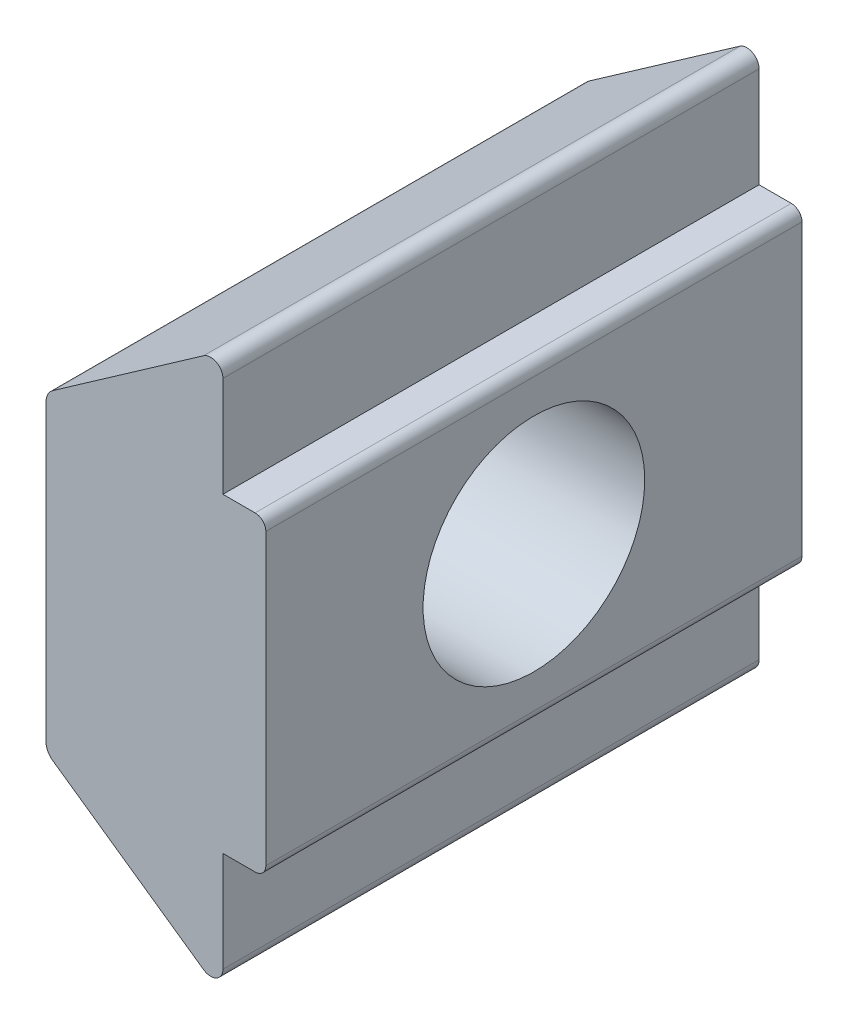
ISO-10303-21;
HEADER;
FILE_DESCRIPTION(('STEP AP214'),'2;1');
FILE_NAME('part.step','',(''),(''),'','','');
FILE_SCHEMA(('AUTOMOTIVE_DESIGN { 1 0 10303 214 1 1 1 1 }'));
ENDSEC;
DATA;
#1=APPLICATION_CONTEXT('core data for automotive mechanical design processes');
#2=APPLICATION_PROTOCOL_DEFINITION('international standard','automotive_design',2000,#1);
#3=PRODUCT_CONTEXT('',#1,'mechanical');
#4=PRODUCT('Part','Part','',(#3));
#5=PRODUCT_RELATED_PRODUCT_CATEGORY('part','',(#4));
#6=PRODUCT_DEFINITION_FORMATION('','',#4);
#7=PRODUCT_DEFINITION_CONTEXT('part definition',#1,'design');
#8=PRODUCT_DEFINITION('design','',#6,#7);
#9=PRODUCT_DEFINITION_SHAPE('','',#8);
#10=(LENGTH_UNIT() NAMED_UNIT(*) SI_UNIT(.MILLI.,.METRE.));
#11=(NAMED_UNIT(*) PLANE_ANGLE_UNIT() SI_UNIT($,.RADIAN.));
#12=(NAMED_UNIT(*) SI_UNIT($,.STERADIAN.) SOLID_ANGLE_UNIT());
#13=UNCERTAINTY_MEASURE_WITH_UNIT(LENGTH_MEASURE(1.E-05),#10,'distance_accuracy_value','');
#14=(GEOMETRIC_REPRESENTATION_CONTEXT(3) GLOBAL_UNCERTAINTY_ASSIGNED_CONTEXT((#13)) GLOBAL_UNIT_ASSIGNED_CONTEXT((#10,
#11,#12)) REPRESENTATION_CONTEXT('',''));
#15=CARTESIAN_POINT('',(0.,0.,0.));
#16=DIRECTION('',(0.,0.,1.));
#17=DIRECTION('',(1.,0.,0.));
#18=AXIS2_PLACEMENT_3D('',#15,#16,#17);
#19=CARTESIAN_POINT('',(-3.80000000000001,2.74382988483449,5.));
#20=DIRECTION('',(0.,0.,-1.));
#21=DIRECTION('',(-1.,0.,0.));
#22=AXIS2_PLACEMENT_3D('',#19,#20,#21);
#23=CYLINDRICAL_SURFACE('',#22,0.299999999999982);
#24=CARTESIAN_POINT('',(-3.80000000000001,2.74382988483449,-5.));
#25=DIRECTION('',(0.,0.,1.));
#26=DIRECTION('',(1.,0.,0.));
#27=AXIS2_PLACEMENT_3D('',#24,#25,#26);
#28=CIRCLE('',#27,0.299999999999982);
#29=CARTESIAN_POINT('',(-3.97207293090532,2.98957549812117,-5.));
#30=VERTEX_POINT('',#29);
#31=CARTESIAN_POINT('',(-4.1,2.74382988483449,-5.));
#32=VERTEX_POINT('',#31);
#33=EDGE_CURVE('E168',#30,#32,#28,.T.);
#34=ORIENTED_EDGE('',*,*,#33,.T.);
#35=DIRECTION('',(0.,0.,-1.));
#36=VECTOR('',#35,1.);
#37=CARTESIAN_POINT('',(-4.1,2.74382988483449,5.));
#38=LINE('',#37,#36);
#39=CARTESIAN_POINT('',(-4.1,2.74382988483449,5.));
#40=VERTEX_POINT('',#39);
#41=EDGE_CURVE('E11',#40,#32,#38,.T.);
#42=ORIENTED_EDGE('',*,*,#41,.F.);
#43=CARTESIAN_POINT('',(-3.80000000000001,2.74382988483449,5.));
#44=DIRECTION('',(0.,0.,1.));
#45=DIRECTION('',(1.,0.,0.));
#46=AXIS2_PLACEMENT_3D('',#43,#44,#45);
#47=CIRCLE('',#46,0.299999999999982);
#48=CARTESIAN_POINT('',(-3.97207293090532,2.98957549812117,5.));
#49=VERTEX_POINT('',#48);
#50=EDGE_CURVE('E195',#49,#40,#47,.T.);
#51=ORIENTED_EDGE('',*,*,#50,.F.);
#52=DIRECTION('',(0.,0.,-1.));
#53=VECTOR('',#52,1.);
#54=CARTESIAN_POINT('',(-3.97207293090532,2.98957549812117,5.));
#55=LINE('',#54,#53);
#56=EDGE_CURVE('E164',#49,#30,#55,.T.);
#57=ORIENTED_EDGE('',*,*,#56,.T.);
#58=EDGE_LOOP('',(#34,#42,#51,#57));
#59=FACE_BOUND('',#58,.T.);
#60=ADVANCED_FACE('F36',(#59),#23,.T.);
#61=CARTESIAN_POINT('',(-4.1,2.74382988483449,5.));
#62=DIRECTION('',(1.,0.,0.));
#63=DIRECTION('',(0.,1.,0.));
#64=AXIS2_PLACEMENT_3D('',#61,#62,#63);
#65=PLANE('',#64);
#66=CARTESIAN_POINT('',(-4.1,0.,0.));
#67=DIRECTION('',(1.,0.,0.));
#68=DIRECTION('',(0.,0.,-1.));
#69=AXIS2_PLACEMENT_3D('',#66,#67,#68);
#70=CIRCLE('',#69,2.067);
#71=CARTESIAN_POINT('',(-4.1,0.,-2.067));
#72=VERTEX_POINT('',#71);
#73=EDGE_CURVE('E172',#72,#72,#70,.T.);
#74=ORIENTED_EDGE('',*,*,#73,.T.);
#75=EDGE_LOOP('',(#74));
#76=FACE_BOUND('',#75,.T.);
#77=DIRECTION('',(0.,-1.,0.));
#78=VECTOR('',#77,1.);
#79=CARTESIAN_POINT('',(-4.1,2.74382988483449,-5.));
#80=LINE('',#79,#78);
#81=CARTESIAN_POINT('',(-4.1,-2.74382988483449,-5.));
#82=VERTEX_POINT('',#81);
#83=EDGE_CURVE('E171',#32,#82,#80,.T.);
#84=ORIENTED_EDGE('',*,*,#83,.T.);
#85=DIRECTION('',(0.,0.,-1.));
#86=VECTOR('',#85,1.);
#87=CARTESIAN_POINT('',(-4.1,-2.74382988483449,5.));
#88=LINE('',#87,#86);
#89=CARTESIAN_POINT('',(-4.1,-2.74382988483449,5.));
#90=VERTEX_POINT('',#89);
#91=EDGE_CURVE('E44',#90,#82,#88,.T.);
#92=ORIENTED_EDGE('',*,*,#91,.F.);
#93=DIRECTION('',(0.,-1.,0.));
#94=VECTOR('',#93,1.);
#95=CARTESIAN_POINT('',(-4.1,2.74382988483449,5.));
#96=LINE('',#95,#94);
#97=EDGE_CURVE('E113',#40,#90,#96,.T.);
#98=ORIENTED_EDGE('',*,*,#97,.F.);
#99=ORIENTED_EDGE('',*,*,#41,.T.);
#100=EDGE_LOOP('',(#84,#92,#98,#99));
#101=FACE_BOUND('',#100,.T.);
#102=ADVANCED_FACE('F283',(#76,#101),#65,.F.);
#103=CARTESIAN_POINT('',(-3.80000000000001,-2.74382988483449,5.));
#104=DIRECTION('',(0.,0.,-1.));
#105=DIRECTION('',(-1.,0.,0.));
#106=AXIS2_PLACEMENT_3D('',#103,#104,#105);
#107=CYLINDRICAL_SURFACE('',#106,0.299999999999982);
#108=CARTESIAN_POINT('',(-3.80000000000001,-2.74382988483449,-5.));
#109=DIRECTION('',(0.,0.,1.));
#110=DIRECTION('',(1.,0.,0.));
#111=AXIS2_PLACEMENT_3D('',#108,#109,#110);
#112=CIRCLE('',#111,0.299999999999982);
#113=CARTESIAN_POINT('',(-3.97207293090532,-2.98957549812117,-5.));
#114=VERTEX_POINT('',#113);
#115=EDGE_CURVE('E174',#82,#114,#112,.T.);
#116=ORIENTED_EDGE('',*,*,#115,.T.);
#117=DIRECTION('',(0.,0.,-1.));
#118=VECTOR('',#117,1.);
#119=CARTESIAN_POINT('',(-3.97207293090532,-2.98957549812117,5.));
#120=LINE('',#119,#118);
#121=CARTESIAN_POINT('',(-3.97207293090532,-2.98957549812117,5.));
#122=VERTEX_POINT('',#121);
#123=EDGE_CURVE('E220',#122,#114,#120,.T.);
#124=ORIENTED_EDGE('',*,*,#123,.F.);
#125=CARTESIAN_POINT('',(-3.80000000000001,-2.74382988483449,5.));
#126=DIRECTION('',(0.,0.,1.));
#127=DIRECTION('',(1.,0.,0.));
#128=AXIS2_PLACEMENT_3D('',#125,#126,#127);
#129=CIRCLE('',#128,0.299999999999982);
#130=EDGE_CURVE('E228',#90,#122,#129,.T.);
#131=ORIENTED_EDGE('',*,*,#130,.F.);
#132=ORIENTED_EDGE('',*,*,#91,.T.);
#133=EDGE_LOOP('',(#116,#124,#131,#132));
#134=FACE_BOUND('',#133,.T.);
#135=ADVANCED_FACE('F226',(#134),#107,.T.);
#136=CARTESIAN_POINT('',(-3.97207293090532,-2.98957549812117,5.));
#137=DIRECTION('',(0.573576436351045,0.819152044288993,0.));
#138=DIRECTION('',(-0.819152044288993,0.573576436351045,0.));
#139=AXIS2_PLACEMENT_3D('',#136,#137,#138);
#140=PLANE('',#139);
#141=DIRECTION('',(0.819152044288992,-0.573576436351045,0.));
#142=VECTOR('',#141,1.);
#143=CARTESIAN_POINT('',(-3.97207293090532,-2.98957549812117,-5.));
#144=LINE('',#143,#142);
#145=CARTESIAN_POINT('',(-1.15997306223983,-4.95862902435927,-5.));
#146=VERTEX_POINT('',#145);
#147=EDGE_CURVE('E176',#114,#146,#144,.T.);
#148=ORIENTED_EDGE('',*,*,#147,.T.);
#149=DIRECTION('',(0.,0.,-1.));
#150=VECTOR('',#149,1.);
#151=CARTESIAN_POINT('',(-1.15997306223983,-4.95862902435927,5.));
#152=LINE('',#151,#150);
#153=CARTESIAN_POINT('',(-1.15997306223983,-4.95862902435927,5.));
#154=VERTEX_POINT('',#153);
#155=EDGE_CURVE('E217',#154,#146,#152,.T.);
#156=ORIENTED_EDGE('',*,*,#155,.F.);
#157=DIRECTION('',(0.819152044288992,-0.573576436351045,0.));
#158=VECTOR('',#157,1.);
#159=CARTESIAN_POINT('',(-3.97207293090532,-2.98957549812117,5.));
#160=LINE('',#159,#158);
#161=EDGE_CURVE('E246',#122,#154,#160,.T.);
#162=ORIENTED_EDGE('',*,*,#161,.F.);
#163=ORIENTED_EDGE('',*,*,#123,.T.);
#164=EDGE_LOOP('',(#148,#156,#162,#163));
#165=FACE_BOUND('',#164,.T.);
#166=ADVANCED_FACE('F237',(#165),#140,.F.);
#167=CARTESIAN_POINT('',(-1.028761090929,-4.771238909071,5.));
#168=DIRECTION('',(0.,0.,-1.));
#169=DIRECTION('',(-1.,0.,0.));
#170=AXIS2_PLACEMENT_3D('',#167,#168,#169);
#171=CYLINDRICAL_SURFACE('',#170,0.228761090929);
#172=CARTESIAN_POINT('',(-1.028761090929,-4.771238909071,-5.));
#173=DIRECTION('',(0.,0.,1.));
#174=DIRECTION('',(1.,0.,0.));
#175=AXIS2_PLACEMENT_3D('',#172,#173,#174);
#176=CIRCLE('',#175,0.228761090929);
#177=CARTESIAN_POINT('',(-0.799999999999996,-4.771238909071,-5.));
#178=VERTEX_POINT('',#177);
#179=EDGE_CURVE('E178',#146,#178,#176,.T.);
#180=ORIENTED_EDGE('',*,*,#179,.T.);
#181=DIRECTION('',(0.,0.,-1.));
#182=VECTOR('',#181,1.);
#183=CARTESIAN_POINT('',(-0.799999999999996,-4.771238909071,5.));
#184=LINE('',#183,#182);
#185=CARTESIAN_POINT('',(-0.799999999999996,-4.771238909071,5.));
#186=VERTEX_POINT('',#185);
#187=EDGE_CURVE('E214',#186,#178,#184,.T.);
#188=ORIENTED_EDGE('',*,*,#187,.F.);
#189=CARTESIAN_POINT('',(-1.028761090929,-4.771238909071,5.));
#190=DIRECTION('',(0.,0.,1.));
#191=DIRECTION('',(1.,0.,0.));
#192=AXIS2_PLACEMENT_3D('',#189,#190,#191);
#193=CIRCLE('',#192,0.228761090929);
#194=EDGE_CURVE('E243',#154,#186,#193,.T.);
#195=ORIENTED_EDGE('',*,*,#194,.F.);
#196=ORIENTED_EDGE('',*,*,#155,.T.);
#197=EDGE_LOOP('',(#180,#188,#195,#196));
#198=FACE_BOUND('',#197,.T.);
#199=ADVANCED_FACE('F241',(#198),#171,.T.);
#200=CARTESIAN_POINT('',(-0.799999999999996,-4.771238909071,5.));
#201=DIRECTION('',(-1.,0.,0.));
#202=DIRECTION('',(0.,-1.,0.));
#203=AXIS2_PLACEMENT_3D('',#200,#201,#202);
#204=PLANE('',#203);
#205=DIRECTION('',(0.,1.,0.));
#206=VECTOR('',#205,1.);
#207=CARTESIAN_POINT('',(-0.799999999999996,-4.771238909071,-5.));
#208=LINE('',#207,#206);
#209=CARTESIAN_POINT('',(-0.799999999999996,-2.9,-5.));
#210=VERTEX_POINT('',#209);
#211=EDGE_CURVE('E180',#178,#210,#208,.T.);
#212=ORIENTED_EDGE('',*,*,#211,.T.);
#213=DIRECTION('',(0.,0.,-1.));
#214=VECTOR('',#213,1.);
#215=CARTESIAN_POINT('',(-0.799999999999996,-2.9,5.));
#216=LINE('',#215,#214);
#217=CARTESIAN_POINT('',(-0.799999999999996,-2.9,5.));
#218=VERTEX_POINT('',#217);
#219=EDGE_CURVE('E211',#218,#210,#216,.T.);
#220=ORIENTED_EDGE('',*,*,#219,.F.);
#221=DIRECTION('',(0.,1.,0.));
#222=VECTOR('',#221,1.);
#223=CARTESIAN_POINT('',(-0.799999999999996,-4.771238909071,5.));
#224=LINE('',#223,#222);
#225=EDGE_CURVE('E245',#186,#218,#224,.T.);
#226=ORIENTED_EDGE('',*,*,#225,.F.);
#227=ORIENTED_EDGE('',*,*,#187,.T.);
#228=EDGE_LOOP('',(#212,#220,#226,#227));
#229=FACE_BOUND('',#228,.T.);
#230=ADVANCED_FACE('F298',(#229),#204,.F.);
#231=CARTESIAN_POINT('',(-0.799999999999996,-2.9,5.));
#232=DIRECTION('',(0.,1.,0.));
#233=DIRECTION('',(-1.,0.,0.));
#234=AXIS2_PLACEMENT_3D('',#231,#232,#233);
#235=PLANE('',#234);
#236=DIRECTION('',(1.,0.,0.));
#237=VECTOR('',#236,1.);
#238=CARTESIAN_POINT('',(-0.799999999999996,-2.9,-5.));
#239=LINE('',#238,#237);
#240=CARTESIAN_POINT('',(-0.199999999999994,-2.9,-5.));
#241=VERTEX_POINT('',#240);
#242=EDGE_CURVE('E182',#210,#241,#239,.T.);
#243=ORIENTED_EDGE('',*,*,#242,.T.);
#244=DIRECTION('',(0.,0.,-1.));
#245=VECTOR('',#244,1.);
#246=CARTESIAN_POINT('',(-0.199999999999994,-2.9,5.));
#247=LINE('',#246,#245);
#248=CARTESIAN_POINT('',(-0.199999999999994,-2.9,5.));
#249=VERTEX_POINT('',#248);
#250=EDGE_CURVE('E208',#249,#241,#247,.T.);
#251=ORIENTED_EDGE('',*,*,#250,.F.);
#252=DIRECTION('',(1.,0.,0.));
#253=VECTOR('',#252,1.);
#254=CARTESIAN_POINT('',(-0.799999999999996,-2.9,5.));
#255=LINE('',#254,#253);
#256=EDGE_CURVE('E248',#218,#249,#255,.T.);
#257=ORIENTED_EDGE('',*,*,#256,.F.);
#258=ORIENTED_EDGE('',*,*,#219,.T.);
#259=EDGE_LOOP('',(#243,#251,#257,#258));
#260=FACE_BOUND('',#259,.T.);
#261=ADVANCED_FACE('F301',(#260),#235,.F.);
#262=CARTESIAN_POINT('',(-0.200000000000001,-2.7,5.));
#263=DIRECTION('',(0.,0.,-1.));
#264=DIRECTION('',(-1.,0.,0.));
#265=AXIS2_PLACEMENT_3D('',#262,#263,#264);
#266=CYLINDRICAL_SURFACE('',#265,0.200000000000001);
#267=CARTESIAN_POINT('',(-0.200000000000001,-2.7,-5.));
#268=DIRECTION('',(0.,0.,1.));
#269=DIRECTION('',(1.,0.,0.));
#270=AXIS2_PLACEMENT_3D('',#267,#268,#269);
#271=CIRCLE('',#270,0.200000000000001);
#272=CARTESIAN_POINT('',(0.,-2.7,-5.));
#273=VERTEX_POINT('',#272);
#274=EDGE_CURVE('E184',#241,#273,#271,.T.);
#275=ORIENTED_EDGE('',*,*,#274,.T.);
#276=DIRECTION('',(0.,0.,-1.));
#277=VECTOR('',#276,1.);
#278=CARTESIAN_POINT('',(0.,-2.7,5.));
#279=LINE('',#278,#277);
#280=CARTESIAN_POINT('',(0.,-2.7,5.));
#281=VERTEX_POINT('',#280);
#282=EDGE_CURVE('E205',#281,#273,#279,.T.);
#283=ORIENTED_EDGE('',*,*,#282,.F.);
#284=CARTESIAN_POINT('',(-0.200000000000001,-2.7,5.));
#285=DIRECTION('',(0.,0.,1.));
#286=DIRECTION('',(1.,0.,0.));
#287=AXIS2_PLACEMENT_3D('',#284,#285,#286);
#288=CIRCLE('',#287,0.200000000000001);
#289=EDGE_CURVE('E254',#249,#281,#288,.T.);
#290=ORIENTED_EDGE('',*,*,#289,.F.);
#291=ORIENTED_EDGE('',*,*,#250,.T.);
#292=EDGE_LOOP('',(#275,#283,#290,#291));
#293=FACE_BOUND('',#292,.T.);
#294=ADVANCED_FACE('F305',(#293),#266,.T.);
#295=CARTESIAN_POINT('',(0.,-2.7,5.));
#296=DIRECTION('',(-1.,0.,0.));
#297=DIRECTION('',(0.,-1.,0.));
#298=AXIS2_PLACEMENT_3D('',#295,#296,#297);
#299=PLANE('',#298);
#300=CARTESIAN_POINT('',(0.,0.,0.));
#301=DIRECTION('',(1.,0.,0.));
#302=DIRECTION('',(0.,0.,-1.));
#303=AXIS2_PLACEMENT_3D('',#300,#301,#302);
#304=CIRCLE('',#303,2.06699999999999);
#305=CARTESIAN_POINT('',(0.,0.,-2.06699999999999));
#306=VERTEX_POINT('',#305);
#307=EDGE_CURVE('E378',#306,#306,#304,.T.);
#308=ORIENTED_EDGE('',*,*,#307,.F.);
#309=EDGE_LOOP('',(#308));
#310=FACE_BOUND('',#309,.T.);
#311=DIRECTION('',(0.,1.,0.));
#312=VECTOR('',#311,1.);
#313=CARTESIAN_POINT('',(0.,-2.7,-5.));
#314=LINE('',#313,#312);
#315=CARTESIAN_POINT('',(0.,2.7,-5.));
#316=VERTEX_POINT('',#315);
#317=EDGE_CURVE('E186',#273,#316,#314,.T.);
#318=ORIENTED_EDGE('',*,*,#317,.T.);
#319=DIRECTION('',(0.,0.,-1.));
#320=VECTOR('',#319,1.);
#321=CARTESIAN_POINT('',(0.,2.7,5.));
#322=LINE('',#321,#320);
#323=CARTESIAN_POINT('',(0.,2.7,5.));
#324=VERTEX_POINT('',#323);
#325=EDGE_CURVE('E202',#324,#316,#322,.T.);
#326=ORIENTED_EDGE('',*,*,#325,.F.);
#327=DIRECTION('',(0.,1.,0.));
#328=VECTOR('',#327,1.);
#329=CARTESIAN_POINT('',(0.,-2.7,5.));
#330=LINE('',#329,#328);
#331=EDGE_CURVE('E256',#281,#324,#330,.T.);
#332=ORIENTED_EDGE('',*,*,#331,.F.);
#333=ORIENTED_EDGE('',*,*,#282,.T.);
#334=EDGE_LOOP('',(#318,#326,#332,#333));
#335=FACE_BOUND('',#334,.T.);
#336=ADVANCED_FACE('F309',(#310,#335),#299,.F.);
#337=CARTESIAN_POINT('',(-0.199999999999999,2.7,5.));
#338=DIRECTION('',(0.,0.,-1.));
#339=DIRECTION('',(-1.,0.,0.));
#340=AXIS2_PLACEMENT_3D('',#337,#338,#339);
#341=CYLINDRICAL_SURFACE('',#340,0.199999999999999);
#342=CARTESIAN_POINT('',(-0.199999999999999,2.7,-5.));
#343=DIRECTION('',(0.,0.,1.));
#344=DIRECTION('',(1.,0.,0.));
#345=AXIS2_PLACEMENT_3D('',#342,#343,#344);
#346=CIRCLE('',#345,0.199999999999999);
#347=CARTESIAN_POINT('',(-0.199999999999999,2.9,-5.));
#348=VERTEX_POINT('',#347);
#349=EDGE_CURVE('E188',#316,#348,#346,.T.);
#350=ORIENTED_EDGE('',*,*,#349,.T.);
#351=DIRECTION('',(0.,0.,-1.));
#352=VECTOR('',#351,1.);
#353=CARTESIAN_POINT('',(-0.199999999999999,2.9,5.));
#354=LINE('',#353,#352);
#355=CARTESIAN_POINT('',(-0.199999999999999,2.9,5.));
#356=VERTEX_POINT('',#355);
#357=EDGE_CURVE('E199',#356,#348,#354,.T.);
#358=ORIENTED_EDGE('',*,*,#357,.F.);
#359=CARTESIAN_POINT('',(-0.199999999999999,2.7,5.));
#360=DIRECTION('',(0.,0.,1.));
#361=DIRECTION('',(1.,0.,0.));
#362=AXIS2_PLACEMENT_3D('',#359,#360,#361);
#363=CIRCLE('',#362,0.199999999999999);
#364=EDGE_CURVE('E258',#324,#356,#363,.T.);
#365=ORIENTED_EDGE('',*,*,#364,.F.);
#366=ORIENTED_EDGE('',*,*,#325,.T.);
#367=EDGE_LOOP('',(#350,#358,#365,#366));
#368=FACE_BOUND('',#367,.T.);
#369=ADVANCED_FACE('F264',(#368),#341,.T.);
#370=CARTESIAN_POINT('',(-0.199999999999999,2.9,5.));
#371=DIRECTION('',(0.,-1.,0.));
#372=DIRECTION('',(1.,0.,0.));
#373=AXIS2_PLACEMENT_3D('',#370,#371,#372);
#374=PLANE('',#373);
#375=DIRECTION('',(-1.,0.,0.));
#376=VECTOR('',#375,1.);
#377=CARTESIAN_POINT('',(-0.199999999999999,2.9,-5.));
#378=LINE('',#377,#376);
#379=CARTESIAN_POINT('',(-0.799999999999997,2.9,-5.));
#380=VERTEX_POINT('',#379);
#381=EDGE_CURVE('E190',#348,#380,#378,.T.);
#382=ORIENTED_EDGE('',*,*,#381,.T.);
#383=DIRECTION('',(0.,0.,-1.));
#384=VECTOR('',#383,1.);
#385=CARTESIAN_POINT('',(-0.799999999999997,2.9,5.));
#386=LINE('',#385,#384);
#387=CARTESIAN_POINT('',(-0.799999999999997,2.9,5.));
#388=VERTEX_POINT('',#387);
#389=EDGE_CURVE('E159',#388,#380,#386,.T.);
#390=ORIENTED_EDGE('',*,*,#389,.F.);
#391=DIRECTION('',(-1.,0.,0.));
#392=VECTOR('',#391,1.);
#393=CARTESIAN_POINT('',(-0.199999999999999,2.9,5.));
#394=LINE('',#393,#392);
#395=EDGE_CURVE('E150',#356,#388,#394,.T.);
#396=ORIENTED_EDGE('',*,*,#395,.F.);
#397=ORIENTED_EDGE('',*,*,#357,.T.);
#398=EDGE_LOOP('',(#382,#390,#396,#397));
#399=FACE_BOUND('',#398,.T.);
#400=ADVANCED_FACE('F268',(#399),#374,.F.);
#401=CARTESIAN_POINT('',(-0.799999999999997,2.9,5.));
#402=DIRECTION('',(-1.,0.,0.));
#403=DIRECTION('',(0.,-1.,0.));
#404=AXIS2_PLACEMENT_3D('',#401,#402,#403);
#405=PLANE('',#404);
#406=DIRECTION('',(0.,1.,0.));
#407=VECTOR('',#406,1.);
#408=CARTESIAN_POINT('',(-0.799999999999997,2.9,-5.));
#409=LINE('',#408,#407);
#410=CARTESIAN_POINT('',(-0.799999999999997,4.771238909071,-5.));
#411=VERTEX_POINT('',#410);
#412=EDGE_CURVE('E158',#380,#411,#409,.T.);
#413=ORIENTED_EDGE('',*,*,#412,.T.);
#414=DIRECTION('',(0.,0.,-1.));
#415=VECTOR('',#414,1.);
#416=CARTESIAN_POINT('',(-0.799999999999997,4.771238909071,5.));
#417=LINE('',#416,#415);
#418=CARTESIAN_POINT('',(-0.799999999999997,4.771238909071,5.));
#419=VERTEX_POINT('',#418);
#420=EDGE_CURVE('E155',#419,#411,#417,.T.);
#421=ORIENTED_EDGE('',*,*,#420,.F.);
#422=DIRECTION('',(0.,1.,0.));
#423=VECTOR('',#422,1.);
#424=CARTESIAN_POINT('',(-0.799999999999997,2.9,5.));
#425=LINE('',#424,#423);
#426=EDGE_CURVE('E144',#388,#419,#425,.T.);
#427=ORIENTED_EDGE('',*,*,#426,.F.);
#428=ORIENTED_EDGE('',*,*,#389,.T.);
#429=EDGE_LOOP('',(#413,#421,#427,#428));
#430=FACE_BOUND('',#429,.T.);
#431=ADVANCED_FACE('F156',(#430),#405,.F.);
#432=CARTESIAN_POINT('',(-1.028761090929,4.771238909071,5.));
#433=DIRECTION('',(0.,0.,-1.));
#434=DIRECTION('',(-1.,0.,0.));
#435=AXIS2_PLACEMENT_3D('',#432,#433,#434);
#436=CYLINDRICAL_SURFACE('',#435,0.228761090929001);
#437=CARTESIAN_POINT('',(-1.028761090929,4.771238909071,-5.));
#438=DIRECTION('',(0.,0.,1.));
#439=DIRECTION('',(1.,0.,0.));
#440=AXIS2_PLACEMENT_3D('',#437,#438,#439);
#441=CIRCLE('',#440,0.228761090929001);
#442=CARTESIAN_POINT('',(-1.15997306223983,4.95862902435927,-5.));
#443=VERTEX_POINT('',#442);
#444=EDGE_CURVE('E99',#411,#443,#441,.T.);
#445=ORIENTED_EDGE('',*,*,#444,.T.);
#446=DIRECTION('',(0.,0.,-1.));
#447=VECTOR('',#446,1.);
#448=CARTESIAN_POINT('',(-1.15997306223983,4.95862902435927,5.));
#449=LINE('',#448,#447);
#450=CARTESIAN_POINT('',(-1.15997306223983,4.95862902435927,5.));
#451=VERTEX_POINT('',#450);
#452=EDGE_CURVE('E160',#451,#443,#449,.T.);
#453=ORIENTED_EDGE('',*,*,#452,.F.);
#454=CARTESIAN_POINT('',(-1.028761090929,4.771238909071,5.));
#455=DIRECTION('',(0.,0.,1.));
#456=DIRECTION('',(1.,0.,0.));
#457=AXIS2_PLACEMENT_3D('',#454,#455,#456);
#458=CIRCLE('',#457,0.228761090929001);
#459=EDGE_CURVE('E148',#419,#451,#458,.T.);
#460=ORIENTED_EDGE('',*,*,#459,.F.);
#461=ORIENTED_EDGE('',*,*,#420,.T.);
#462=EDGE_LOOP('',(#445,#453,#460,#461));
#463=FACE_BOUND('',#462,.T.);
#464=ADVANCED_FACE('F162',(#463),#436,.T.);
#465=CARTESIAN_POINT('',(-1.15997306223983,4.95862902435927,5.));
#466=DIRECTION('',(0.573576436351045,-0.819152044288992,0.));
#467=DIRECTION('',(0.819152044288992,0.573576436351045,0.));
#468=AXIS2_PLACEMENT_3D('',#465,#466,#467);
#469=PLANE('',#468);
#470=DIRECTION('',(-0.819152044288992,-0.573576436351045,0.));
#471=VECTOR('',#470,1.);
#472=CARTESIAN_POINT('',(-1.15997306223983,4.95862902435927,-5.));
#473=LINE('',#472,#471);
#474=EDGE_CURVE('E105',#443,#30,#473,.T.);
#475=ORIENTED_EDGE('',*,*,#474,.T.);
#476=ORIENTED_EDGE('',*,*,#56,.F.);
#477=DIRECTION('',(-0.819152044288992,-0.573576436351045,0.));
#478=VECTOR('',#477,1.);
#479=CARTESIAN_POINT('',(-1.15997306223983,4.95862902435927,5.));
#480=LINE('',#479,#478);
#481=EDGE_CURVE('E52',#451,#49,#480,.T.);
#482=ORIENTED_EDGE('',*,*,#481,.F.);
#483=ORIENTED_EDGE('',*,*,#452,.T.);
#484=EDGE_LOOP('',(#475,#476,#482,#483));
#485=FACE_BOUND('',#484,.T.);
#486=ADVANCED_FACE('F272',(#485),#469,.F.);
#487=CARTESIAN_POINT('',(-3.80000000000001,2.74382988483449,5.));
#488=DIRECTION('',(0.,0.,1.));
#489=DIRECTION('',(1.,0.,0.));
#490=AXIS2_PLACEMENT_3D('',#487,#488,#489);
#491=PLANE('',#490);
#492=ORIENTED_EDGE('',*,*,#50,.T.);
#493=ORIENTED_EDGE('',*,*,#97,.T.);
#494=ORIENTED_EDGE('',*,*,#130,.T.);
#495=ORIENTED_EDGE('',*,*,#161,.T.);
#496=ORIENTED_EDGE('',*,*,#194,.T.);
#497=ORIENTED_EDGE('',*,*,#225,.T.);
#498=ORIENTED_EDGE('',*,*,#256,.T.);
#499=ORIENTED_EDGE('',*,*,#289,.T.);
#500=ORIENTED_EDGE('',*,*,#331,.T.);
#501=ORIENTED_EDGE('',*,*,#364,.T.);
#502=ORIENTED_EDGE('',*,*,#395,.T.);
#503=ORIENTED_EDGE('',*,*,#426,.T.);
#504=ORIENTED_EDGE('',*,*,#459,.T.);
#505=ORIENTED_EDGE('',*,*,#481,.T.);
#506=EDGE_LOOP('',(#492,#493,#494,#495,#496,#497,#498,#499,#500,#501,#502,#503,#504,#505));
#507=FACE_BOUND('',#506,.T.);
#508=ADVANCED_FACE('F146',(#507),#491,.T.);
#509=CARTESIAN_POINT('',(-3.80000000000001,2.74382988483449,-5.));
#510=DIRECTION('',(0.,0.,1.));
#511=DIRECTION('',(1.,0.,0.));
#512=AXIS2_PLACEMENT_3D('',#509,#510,#511);
#513=PLANE('',#512);
#514=ORIENTED_EDGE('',*,*,#33,.F.);
#515=ORIENTED_EDGE('',*,*,#474,.F.);
#516=ORIENTED_EDGE('',*,*,#444,.F.);
#517=ORIENTED_EDGE('',*,*,#412,.F.);
#518=ORIENTED_EDGE('',*,*,#381,.F.);
#519=ORIENTED_EDGE('',*,*,#349,.F.);
#520=ORIENTED_EDGE('',*,*,#317,.F.);
#521=ORIENTED_EDGE('',*,*,#274,.F.);
#522=ORIENTED_EDGE('',*,*,#242,.F.);
#523=ORIENTED_EDGE('',*,*,#211,.F.);
#524=ORIENTED_EDGE('',*,*,#179,.F.);
#525=ORIENTED_EDGE('',*,*,#147,.F.);
#526=ORIENTED_EDGE('',*,*,#115,.F.);
#527=ORIENTED_EDGE('',*,*,#83,.F.);
#528=EDGE_LOOP('',(#514,#515,#516,#517,#518,#519,#520,#521,#522,#523,#524,#525,#526,#527));
#529=FACE_BOUND('',#528,.T.);
#530=ADVANCED_FACE('F232',(#529),#513,.F.);
#531=CARTESIAN_POINT('',(0.,0.,0.));
#532=DIRECTION('',(1.,0.,0.));
#533=DIRECTION('',(0.,0.,-1.));
#534=AXIS2_PLACEMENT_3D('',#531,#532,#533);
#535=CYLINDRICAL_SURFACE('',#534,2.06699999999999);
#536=ORIENTED_EDGE('',*,*,#73,.F.);
#537=EDGE_LOOP('',(#536));
#538=FACE_BOUND('',#537,.T.);
#539=ORIENTED_EDGE('',*,*,#307,.T.);
#540=EDGE_LOOP('',(#539));
#541=FACE_BOUND('',#540,.T.);
#542=ADVANCED_FACE('F345',(#538,#541),#535,.F.);
#543=CLOSED_SHELL('',(#60,#102,#135,#166,#199,#230,#261,#294,#336,#369,#400,#431,#464,#486,#508,
#530,#542));
#544=MANIFOLD_SOLID_BREP('B2',#543);
#545=ADVANCED_BREP_SHAPE_REPRESENTATION('',(#18,#544),#14);
#546=SHAPE_DEFINITION_REPRESENTATION(#9,#545);
ENDSEC;
END-ISO-10303-21;
